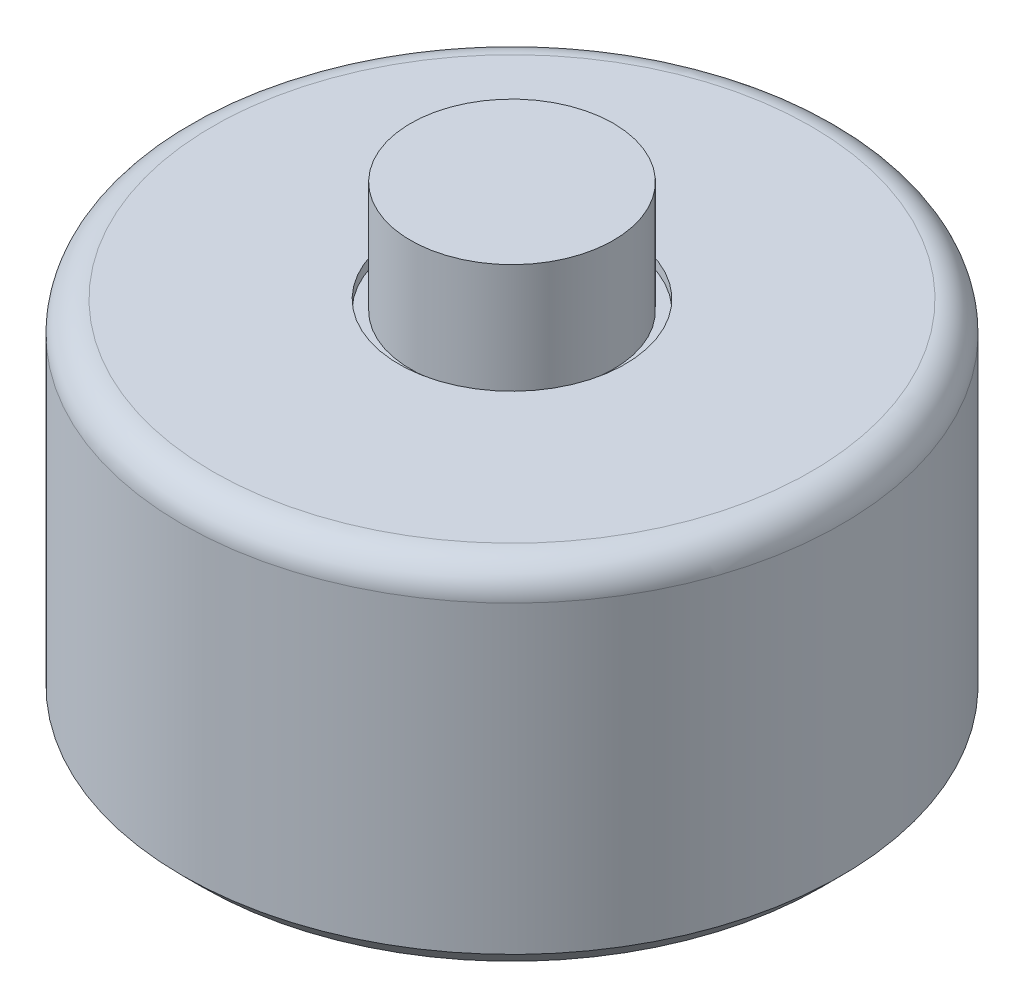
ISO-10303-21;
HEADER;
FILE_DESCRIPTION(('STEP AP214'),'2;1');
FILE_NAME('part.step','',(''),(''),'','','');
FILE_SCHEMA(('AUTOMOTIVE_DESIGN { 1 0 10303 214 1 1 1 1 }'));
ENDSEC;
DATA;
#1=APPLICATION_CONTEXT('core data for automotive mechanical design processes');
#2=APPLICATION_PROTOCOL_DEFINITION('international standard','automotive_design',2000,#1);
#3=PRODUCT_CONTEXT('',#1,'mechanical');
#4=PRODUCT('Part','Part','',(#3));
#5=PRODUCT_RELATED_PRODUCT_CATEGORY('part','',(#4));
#6=PRODUCT_DEFINITION_FORMATION('','',#4);
#7=PRODUCT_DEFINITION_CONTEXT('part definition',#1,'design');
#8=PRODUCT_DEFINITION('design','',#6,#7);
#9=PRODUCT_DEFINITION_SHAPE('','',#8);
#10=(LENGTH_UNIT() NAMED_UNIT(*) SI_UNIT(.MILLI.,.METRE.));
#11=(NAMED_UNIT(*) PLANE_ANGLE_UNIT() SI_UNIT($,.RADIAN.));
#12=(NAMED_UNIT(*) SI_UNIT($,.STERADIAN.) SOLID_ANGLE_UNIT());
#13=UNCERTAINTY_MEASURE_WITH_UNIT(LENGTH_MEASURE(1.E-05),#10,'distance_accuracy_value','');
#14=(GEOMETRIC_REPRESENTATION_CONTEXT(3) GLOBAL_UNCERTAINTY_ASSIGNED_CONTEXT((#13)) GLOBAL_UNIT_ASSIGNED_CONTEXT((#10,
#11,#12)) REPRESENTATION_CONTEXT('',''));
#15=CARTESIAN_POINT('',(0.,0.,0.));
#16=DIRECTION('',(0.,0.,1.));
#17=DIRECTION('',(1.,0.,0.));
#18=AXIS2_PLACEMENT_3D('',#15,#16,#17);
#19=CARTESIAN_POINT('',(8.255,0.,0.));
#20=DIRECTION('',(0.,-1.,0.));
#21=DIRECTION('',(0.,0.,-1.));
#22=AXIS2_PLACEMENT_3D('',#19,#20,#21);
#23=PLANE('',#22);
#24=DIRECTION('',(1.,0.,0.));
#25=VECTOR('',#24,1.);
#26=CARTESIAN_POINT('',(-0.539750000000016,0.,4.826));
#27=LINE('',#26,#25);
#28=CARTESIAN_POINT('',(-0.539750000000016,0.,4.826));
#29=VERTEX_POINT('',#28);
#30=CARTESIAN_POINT('',(0.539749999999983,0.,4.826));
#31=VERTEX_POINT('',#30);
#32=EDGE_CURVE('E64',#29,#31,#27,.T.);
#33=ORIENTED_EDGE('',*,*,#32,.F.);
#34=DIRECTION('',(0.,0.,-1.));
#35=VECTOR('',#34,1.);
#36=CARTESIAN_POINT('',(-0.539750000000016,0.,4.826));
#37=LINE('',#36,#35);
#38=CARTESIAN_POINT('',(-0.539750000000024,0.,6.731));
#39=VERTEX_POINT('',#38);
#40=EDGE_CURVE('E200',#39,#29,#37,.T.);
#41=ORIENTED_EDGE('',*,*,#40,.F.);
#42=DIRECTION('',(-1.,0.,0.));
#43=VECTOR('',#42,1.);
#44=CARTESIAN_POINT('',(-0.539750000000024,0.,6.731));
#45=LINE('',#44,#43);
#46=CARTESIAN_POINT('',(0.539749999999976,0.,6.731));
#47=VERTEX_POINT('',#46);
#48=EDGE_CURVE('E188',#47,#39,#45,.T.);
#49=ORIENTED_EDGE('',*,*,#48,.F.);
#50=DIRECTION('',(0.,0.,1.));
#51=VECTOR('',#50,1.);
#52=CARTESIAN_POINT('',(0.539749999999983,0.,4.826));
#53=LINE('',#52,#51);
#54=EDGE_CURVE('E174',#31,#47,#53,.T.);
#55=ORIENTED_EDGE('',*,*,#54,.F.);
#56=EDGE_LOOP('',(#33,#41,#49,#55));
#57=FACE_BOUND('',#56,.T.);
#58=DIRECTION('',(0.,0.,1.));
#59=VECTOR('',#58,1.);
#60=CARTESIAN_POINT('',(-4.826,0.,-0.53975));
#61=LINE('',#60,#59);
#62=CARTESIAN_POINT('',(-4.826,0.,-0.53975));
#63=VERTEX_POINT('',#62);
#64=CARTESIAN_POINT('',(-4.826,0.,0.53975));
#65=VERTEX_POINT('',#64);
#66=EDGE_CURVE('E72',#63,#65,#61,.T.);
#67=ORIENTED_EDGE('',*,*,#66,.F.);
#68=DIRECTION('',(1.,0.,0.));
#69=VECTOR('',#68,1.);
#70=CARTESIAN_POINT('',(-4.826,0.,-0.53975));
#71=LINE('',#70,#69);
#72=CARTESIAN_POINT('',(-6.731,0.,-0.53975));
#73=VERTEX_POINT('',#72);
#74=EDGE_CURVE('E240',#73,#63,#71,.T.);
#75=ORIENTED_EDGE('',*,*,#74,.F.);
#76=DIRECTION('',(0.,0.,-1.));
#77=VECTOR('',#76,1.);
#78=CARTESIAN_POINT('',(-6.731,0.,-0.53975));
#79=LINE('',#78,#77);
#80=CARTESIAN_POINT('',(-6.731,0.,0.53975));
#81=VERTEX_POINT('',#80);
#82=EDGE_CURVE('E233',#81,#73,#79,.T.);
#83=ORIENTED_EDGE('',*,*,#82,.F.);
#84=DIRECTION('',(-1.,0.,0.));
#85=VECTOR('',#84,1.);
#86=CARTESIAN_POINT('',(-4.826,0.,0.53975));
#87=LINE('',#86,#85);
#88=EDGE_CURVE('E209',#65,#81,#87,.T.);
#89=ORIENTED_EDGE('',*,*,#88,.F.);
#90=EDGE_LOOP('',(#67,#75,#83,#89));
#91=FACE_BOUND('',#90,.T.);
#92=DIRECTION('',(-1.,0.,0.));
#93=VECTOR('',#92,1.);
#94=CARTESIAN_POINT('',(0.53975000000005,0.,-4.82599999999999));
#95=LINE('',#94,#93);
#96=CARTESIAN_POINT('',(0.53975000000005,0.,-4.82599999999999));
#97=VERTEX_POINT('',#96);
#98=CARTESIAN_POINT('',(-0.539749999999948,0.,-4.82600000000001));
#99=VERTEX_POINT('',#98);
#100=EDGE_CURVE('E213',#97,#99,#95,.T.);
#101=ORIENTED_EDGE('',*,*,#100,.F.);
#102=DIRECTION('',(0.,0.,1.));
#103=VECTOR('',#102,1.);
#104=CARTESIAN_POINT('',(0.53975000000005,0.,-4.82599999999999));
#105=LINE('',#104,#103);
#106=CARTESIAN_POINT('',(0.539750000000071,0.,-6.73099999999999));
#107=VERTEX_POINT('',#106);
#108=EDGE_CURVE('E279',#107,#97,#105,.T.);
#109=ORIENTED_EDGE('',*,*,#108,.F.);
#110=DIRECTION('',(1.,0.,0.));
#111=VECTOR('',#110,1.);
#112=CARTESIAN_POINT('',(0.539750000000071,0.,-6.73099999999999));
#113=LINE('',#112,#111);
#114=CARTESIAN_POINT('',(-0.539749999999929,0.,-6.73100000000001));
#115=VERTEX_POINT('',#114);
#116=EDGE_CURVE('E272',#115,#107,#113,.T.);
#117=ORIENTED_EDGE('',*,*,#116,.F.);
#118=DIRECTION('',(0.,0.,-1.));
#119=VECTOR('',#118,1.);
#120=CARTESIAN_POINT('',(-0.539749999999949,0.,-4.82600000000001));
#121=LINE('',#120,#119);
#122=EDGE_CURVE('E248',#99,#115,#121,.T.);
#123=ORIENTED_EDGE('',*,*,#122,.F.);
#124=EDGE_LOOP('',(#101,#109,#117,#123));
#125=FACE_BOUND('',#124,.T.);
#126=DIRECTION('',(0.,0.,-1.));
#127=VECTOR('',#126,1.);
#128=CARTESIAN_POINT('',(4.826,0.,0.53975));
#129=LINE('',#128,#127);
#130=CARTESIAN_POINT('',(4.826,0.,0.53975));
#131=VERTEX_POINT('',#130);
#132=CARTESIAN_POINT('',(4.826,0.,-0.53975));
#133=VERTEX_POINT('',#132);
#134=EDGE_CURVE('E208',#131,#133,#129,.T.);
#135=ORIENTED_EDGE('',*,*,#134,.F.);
#136=DIRECTION('',(-1.,0.,0.));
#137=VECTOR('',#136,1.);
#138=CARTESIAN_POINT('',(4.826,0.,0.53975));
#139=LINE('',#138,#137);
#140=CARTESIAN_POINT('',(6.731,0.,0.53975));
#141=VERTEX_POINT('',#140);
#142=EDGE_CURVE('E293',#141,#131,#139,.T.);
#143=ORIENTED_EDGE('',*,*,#142,.F.);
#144=DIRECTION('',(0.,0.,1.));
#145=VECTOR('',#144,1.);
#146=CARTESIAN_POINT('',(6.731,0.,0.53975));
#147=LINE('',#146,#145);
#148=CARTESIAN_POINT('',(6.731,0.,-0.53975));
#149=VERTEX_POINT('',#148);
#150=EDGE_CURVE('E312',#149,#141,#147,.T.);
#151=ORIENTED_EDGE('',*,*,#150,.F.);
#152=DIRECTION('',(1.,0.,0.));
#153=VECTOR('',#152,1.);
#154=CARTESIAN_POINT('',(4.826,0.,-0.53975));
#155=LINE('',#154,#153);
#156=EDGE_CURVE('E308',#133,#149,#155,.T.);
#157=ORIENTED_EDGE('',*,*,#156,.F.);
#158=EDGE_LOOP('',(#135,#143,#151,#157));
#159=FACE_BOUND('',#158,.T.);
#160=CARTESIAN_POINT('',(0.,0.,0.));
#161=DIRECTION('',(0.,-1.,0.));
#162=DIRECTION('',(0.,0.,-1.));
#163=AXIS2_PLACEMENT_3D('',#160,#161,#162);
#164=CIRCLE('',#163,7.747);
#165=CARTESIAN_POINT('',(0.,0.,-7.747));
#166=VERTEX_POINT('',#165);
#167=EDGE_CURVE('E57',#166,#166,#164,.T.);
#168=ORIENTED_EDGE('',*,*,#167,.T.);
#169=EDGE_LOOP('',(#168));
#170=FACE_BOUND('',#169,.T.);
#171=ADVANCED_FACE('F47',(#57,#91,#125,#159,#170),#23,.T.);
#172=CARTESIAN_POINT('',(0.,11.43,0.));
#173=DIRECTION('',(0.,1.,0.));
#174=DIRECTION('',(0.,0.,1.));
#175=AXIS2_PLACEMENT_3D('',#172,#173,#174);
#176=PLANE('',#175);
#177=CARTESIAN_POINT('',(0.,11.43,0.));
#178=DIRECTION('',(0.,-1.,0.));
#179=DIRECTION('',(0.,0.,-1.));
#180=AXIS2_PLACEMENT_3D('',#177,#178,#179);
#181=CIRCLE('',#180,2.54);
#182=CARTESIAN_POINT('',(0.,11.43,-2.54));
#183=VERTEX_POINT('',#182);
#184=EDGE_CURVE('E343',#183,#183,#181,.T.);
#185=ORIENTED_EDGE('',*,*,#184,.F.);
#186=EDGE_LOOP('',(#185));
#187=FACE_BOUND('',#186,.T.);
#188=ADVANCED_FACE('F374',(#187),#176,.T.);
#189=CARTESIAN_POINT('',(0.,0.,0.));
#190=DIRECTION('',(0.,-1.,0.));
#191=DIRECTION('',(0.,0.,-1.));
#192=AXIS2_PLACEMENT_3D('',#189,#190,#191);
#193=CYLINDRICAL_SURFACE('',#192,2.54);
#194=ORIENTED_EDGE('',*,*,#184,.T.);
#195=EDGE_LOOP('',(#194));
#196=FACE_BOUND('',#195,.T.);
#197=CARTESIAN_POINT('',(0.,8.636,0.));
#198=DIRECTION('',(0.,-1.,0.));
#199=DIRECTION('',(0.,0.,-1.));
#200=AXIS2_PLACEMENT_3D('',#197,#198,#199);
#201=CIRCLE('',#200,2.54);
#202=CARTESIAN_POINT('',(0.,8.636,-2.54));
#203=VERTEX_POINT('',#202);
#204=EDGE_CURVE('E339',#203,#203,#201,.T.);
#205=ORIENTED_EDGE('',*,*,#204,.F.);
#206=EDGE_LOOP('',(#205));
#207=FACE_BOUND('',#206,.T.);
#208=ADVANCED_FACE('F380',(#196,#207),#193,.T.);
#209=CARTESIAN_POINT('',(2.54,8.636,0.));
#210=DIRECTION('',(0.,1.,0.));
#211=DIRECTION('',(0.,0.,1.));
#212=AXIS2_PLACEMENT_3D('',#209,#210,#211);
#213=PLANE('',#212);
#214=ORIENTED_EDGE('',*,*,#204,.T.);
#215=EDGE_LOOP('',(#214));
#216=FACE_BOUND('',#215,.T.);
#217=CARTESIAN_POINT('',(0.,8.636,0.));
#218=DIRECTION('',(0.,-1.,0.));
#219=DIRECTION('',(0.,0.,-1.));
#220=AXIS2_PLACEMENT_3D('',#217,#218,#219);
#221=CIRCLE('',#220,2.8321);
#222=CARTESIAN_POINT('',(0.,8.636,-2.8321));
#223=VERTEX_POINT('',#222);
#224=EDGE_CURVE('E335',#223,#223,#221,.T.);
#225=ORIENTED_EDGE('',*,*,#224,.F.);
#226=EDGE_LOOP('',(#225));
#227=FACE_BOUND('',#226,.T.);
#228=ADVANCED_FACE('F387',(#216,#227),#213,.T.);
#229=CARTESIAN_POINT('',(0.,0.,0.));
#230=DIRECTION('',(0.,-1.,0.));
#231=DIRECTION('',(0.,0.,-1.));
#232=AXIS2_PLACEMENT_3D('',#229,#230,#231);
#233=CYLINDRICAL_SURFACE('',#232,2.8321);
#234=ORIENTED_EDGE('',*,*,#224,.T.);
#235=EDGE_LOOP('',(#234));
#236=FACE_BOUND('',#235,.T.);
#237=CARTESIAN_POINT('',(0.,8.89,0.));
#238=DIRECTION('',(0.,-1.,0.));
#239=DIRECTION('',(0.,0.,-1.));
#240=AXIS2_PLACEMENT_3D('',#237,#238,#239);
#241=CIRCLE('',#240,2.8321);
#242=CARTESIAN_POINT('',(0.,8.89,-2.8321));
#243=VERTEX_POINT('',#242);
#244=EDGE_CURVE('E322',#243,#243,#241,.T.);
#245=ORIENTED_EDGE('',*,*,#244,.F.);
#246=EDGE_LOOP('',(#245));
#247=FACE_BOUND('',#246,.T.);
#248=ADVANCED_FACE('F391',(#236,#247),#233,.F.);
#249=CARTESIAN_POINT('',(2.8321,8.89,0.));
#250=DIRECTION('',(0.,1.,0.));
#251=DIRECTION('',(0.,0.,1.));
#252=AXIS2_PLACEMENT_3D('',#249,#250,#251);
#253=PLANE('',#252);
#254=CARTESIAN_POINT('',(0.,8.89,0.));
#255=DIRECTION('',(0.,1.,0.));
#256=DIRECTION('',(0.,0.,1.));
#257=AXIS2_PLACEMENT_3D('',#254,#255,#256);
#258=CIRCLE('',#257,7.493);
#259=CARTESIAN_POINT('',(0.,8.89,7.493));
#260=VERTEX_POINT('',#259);
#261=EDGE_CURVE('E351',#260,#260,#258,.T.);
#262=ORIENTED_EDGE('',*,*,#261,.T.);
#263=EDGE_LOOP('',(#262));
#264=FACE_BOUND('',#263,.T.);
#265=ORIENTED_EDGE('',*,*,#244,.T.);
#266=EDGE_LOOP('',(#265));
#267=FACE_BOUND('',#266,.T.);
#268=ADVANCED_FACE('F395',(#264,#267),#253,.T.);
#269=CARTESIAN_POINT('',(0.,0.,0.));
#270=DIRECTION('',(0.,-1.,0.));
#271=DIRECTION('',(0.,0.,-1.));
#272=AXIS2_PLACEMENT_3D('',#269,#270,#271);
#273=CYLINDRICAL_SURFACE('',#272,8.255);
#274=CARTESIAN_POINT('',(0.,0.508000000000002,0.));
#275=DIRECTION('',(0.,-1.,0.));
#276=DIRECTION('',(0.,0.,-1.));
#277=AXIS2_PLACEMENT_3D('',#274,#275,#276);
#278=CIRCLE('',#277,8.255);
#279=CARTESIAN_POINT('',(0.,0.508000000000002,-8.255));
#280=VERTEX_POINT('',#279);
#281=EDGE_CURVE('E11',#280,#280,#278,.F.);
#282=ORIENTED_EDGE('',*,*,#281,.T.);
#283=EDGE_LOOP('',(#282));
#284=FACE_BOUND('',#283,.T.);
#285=CARTESIAN_POINT('',(0.,8.128,0.));
#286=DIRECTION('',(0.,1.,0.));
#287=DIRECTION('',(0.,0.,1.));
#288=AXIS2_PLACEMENT_3D('',#285,#286,#287);
#289=CIRCLE('',#288,8.255);
#290=CARTESIAN_POINT('',(0.,8.128,8.255));
#291=VERTEX_POINT('',#290);
#292=EDGE_CURVE('E347',#291,#291,#289,.F.);
#293=ORIENTED_EDGE('',*,*,#292,.T.);
#294=EDGE_LOOP('',(#293));
#295=FACE_BOUND('',#294,.T.);
#296=ADVANCED_FACE('F370',(#284,#295),#273,.T.);
#297=CARTESIAN_POINT('',(0.,8.128,0.));
#298=DIRECTION('',(0.,1.,0.));
#299=DIRECTION('',(0.,0.,1.));
#300=AXIS2_PLACEMENT_3D('',#297,#298,#299);
#301=TOROIDAL_SURFACE('',#300,7.493,0.762);
#302=ORIENTED_EDGE('',*,*,#261,.F.);
#303=EDGE_LOOP('',(#302));
#304=FACE_BOUND('',#303,.T.);
#305=ORIENTED_EDGE('',*,*,#292,.F.);
#306=EDGE_LOOP('',(#305));
#307=FACE_BOUND('',#306,.T.);
#308=ADVANCED_FACE('F361',(#304,#307),#301,.T.);
#309=CARTESIAN_POINT('',(0.,0.,0.));
#310=DIRECTION('',(0.,1.,0.));
#311=DIRECTION('',(0.,0.,1.));
#312=AXIS2_PLACEMENT_3D('',#309,#310,#311);
#313=CONICAL_SURFACE('',#312,7.747,0.785398163397445);
#314=ORIENTED_EDGE('',*,*,#281,.F.);
#315=EDGE_LOOP('',(#314));
#316=FACE_BOUND('',#315,.T.);
#317=ORIENTED_EDGE('',*,*,#167,.F.);
#318=EDGE_LOOP('',(#317));
#319=FACE_BOUND('',#318,.T.);
#320=ADVANCED_FACE('F50',(#316,#319),#313,.T.);
#321=CARTESIAN_POINT('',(4.826,0.5715,0.53975));
#322=DIRECTION('',(-1.,0.,0.));
#323=DIRECTION('',(0.,0.,1.));
#324=AXIS2_PLACEMENT_3D('',#321,#322,#323);
#325=PLANE('',#324);
#326=ORIENTED_EDGE('',*,*,#134,.T.);
#327=DIRECTION('',(0.,-1.,0.));
#328=VECTOR('',#327,1.);
#329=CARTESIAN_POINT('',(4.826,0.5715,-0.53975));
#330=LINE('',#329,#328);
#331=CARTESIAN_POINT('',(4.826,0.5715,-0.53975));
#332=VERTEX_POINT('',#331);
#333=EDGE_CURVE('E305',#332,#133,#330,.T.);
#334=ORIENTED_EDGE('',*,*,#333,.F.);
#335=DIRECTION('',(0.,0.,-1.));
#336=VECTOR('',#335,1.);
#337=CARTESIAN_POINT('',(4.826,0.5715,0.53975));
#338=LINE('',#337,#336);
#339=CARTESIAN_POINT('',(4.826,0.5715,0.53975));
#340=VERTEX_POINT('',#339);
#341=EDGE_CURVE('E288',#340,#332,#338,.T.);
#342=ORIENTED_EDGE('',*,*,#341,.F.);
#343=DIRECTION('',(0.,-1.,0.));
#344=VECTOR('',#343,1.);
#345=CARTESIAN_POINT('',(4.826,0.5715,0.53975));
#346=LINE('',#345,#344);
#347=EDGE_CURVE('E319',#340,#131,#346,.T.);
#348=ORIENTED_EDGE('',*,*,#347,.T.);
#349=EDGE_LOOP('',(#326,#334,#342,#348));
#350=FACE_BOUND('',#349,.T.);
#351=ADVANCED_FACE('F360',(#350),#325,.F.);
#352=CARTESIAN_POINT('',(4.826,0.5715,0.53975));
#353=DIRECTION('',(0.,0.,1.));
#354=DIRECTION('',(1.,0.,0.));
#355=AXIS2_PLACEMENT_3D('',#352,#353,#354);
#356=PLANE('',#355);
#357=ORIENTED_EDGE('',*,*,#142,.T.);
#358=ORIENTED_EDGE('',*,*,#347,.F.);
#359=DIRECTION('',(-1.,0.,0.));
#360=VECTOR('',#359,1.);
#361=CARTESIAN_POINT('',(4.826,0.5715,0.53975));
#362=LINE('',#361,#360);
#363=CARTESIAN_POINT('',(6.731,0.5715,0.53975));
#364=VERTEX_POINT('',#363);
#365=EDGE_CURVE('E301',#364,#340,#362,.T.);
#366=ORIENTED_EDGE('',*,*,#365,.F.);
#367=DIRECTION('',(0.,-1.,0.));
#368=VECTOR('',#367,1.);
#369=CARTESIAN_POINT('',(6.731,0.5715,0.53975));
#370=LINE('',#369,#368);
#371=EDGE_CURVE('E323',#364,#141,#370,.T.);
#372=ORIENTED_EDGE('',*,*,#371,.T.);
#373=EDGE_LOOP('',(#357,#358,#366,#372));
#374=FACE_BOUND('',#373,.T.);
#375=ADVANCED_FACE('F367',(#374),#356,.F.);
#376=CARTESIAN_POINT('',(6.731,0.5715,0.53975));
#377=DIRECTION('',(1.,0.,0.));
#378=DIRECTION('',(0.,0.,-1.));
#379=AXIS2_PLACEMENT_3D('',#376,#377,#378);
#380=PLANE('',#379);
#381=ORIENTED_EDGE('',*,*,#150,.T.);
#382=ORIENTED_EDGE('',*,*,#371,.F.);
#383=DIRECTION('',(0.,0.,1.));
#384=VECTOR('',#383,1.);
#385=CARTESIAN_POINT('',(6.731,0.5715,0.53975));
#386=LINE('',#385,#384);
#387=CARTESIAN_POINT('',(6.731,0.5715,-0.53975));
#388=VERTEX_POINT('',#387);
#389=EDGE_CURVE('E297',#388,#364,#386,.T.);
#390=ORIENTED_EDGE('',*,*,#389,.F.);
#391=DIRECTION('',(0.,-1.,0.));
#392=VECTOR('',#391,1.);
#393=CARTESIAN_POINT('',(6.731,0.5715,-0.53975));
#394=LINE('',#393,#392);
#395=EDGE_CURVE('E326',#388,#149,#394,.T.);
#396=ORIENTED_EDGE('',*,*,#395,.T.);
#397=EDGE_LOOP('',(#381,#382,#390,#396));
#398=FACE_BOUND('',#397,.T.);
#399=ADVANCED_FACE('F407',(#398),#380,.F.);
#400=CARTESIAN_POINT('',(4.826,0.5715,-0.53975));
#401=DIRECTION('',(0.,0.,-1.));
#402=DIRECTION('',(-1.,0.,0.));
#403=AXIS2_PLACEMENT_3D('',#400,#401,#402);
#404=PLANE('',#403);
#405=ORIENTED_EDGE('',*,*,#156,.T.);
#406=ORIENTED_EDGE('',*,*,#395,.F.);
#407=DIRECTION('',(1.,0.,0.));
#408=VECTOR('',#407,1.);
#409=CARTESIAN_POINT('',(4.826,0.5715,-0.53975));
#410=LINE('',#409,#408);
#411=EDGE_CURVE('E292',#332,#388,#410,.T.);
#412=ORIENTED_EDGE('',*,*,#411,.F.);
#413=ORIENTED_EDGE('',*,*,#333,.T.);
#414=EDGE_LOOP('',(#405,#406,#412,#413));
#415=FACE_BOUND('',#414,.T.);
#416=ADVANCED_FACE('F403',(#415),#404,.F.);
#417=CARTESIAN_POINT('',(0.,0.5715,0.));
#418=DIRECTION('',(0.,-1.,0.));
#419=DIRECTION('',(0.,0.,-1.));
#420=AXIS2_PLACEMENT_3D('',#417,#418,#419);
#421=PLANE('',#420);
#422=ORIENTED_EDGE('',*,*,#341,.T.);
#423=ORIENTED_EDGE('',*,*,#411,.T.);
#424=ORIENTED_EDGE('',*,*,#389,.T.);
#425=ORIENTED_EDGE('',*,*,#365,.T.);
#426=EDGE_LOOP('',(#422,#423,#424,#425));
#427=FACE_BOUND('',#426,.T.);
#428=ADVANCED_FACE('F406',(#427),#421,.T.);
#429=CARTESIAN_POINT('',(0.53975000000005,0.5715,-4.82599999999999));
#430=DIRECTION('',(0.,0.,1.));
#431=DIRECTION('',(1.,0.,0.));
#432=AXIS2_PLACEMENT_3D('',#429,#430,#431);
#433=PLANE('',#432);
#434=ORIENTED_EDGE('',*,*,#100,.T.);
#435=DIRECTION('',(0.,-1.,0.));
#436=VECTOR('',#435,1.);
#437=CARTESIAN_POINT('',(-0.539749999999949,0.5715,-4.82600000000001));
#438=LINE('',#437,#436);
#439=CARTESIAN_POINT('',(-0.539749999999949,0.5715,-4.82600000000001));
#440=VERTEX_POINT('',#439);
#441=EDGE_CURVE('E268',#440,#99,#438,.T.);
#442=ORIENTED_EDGE('',*,*,#441,.F.);
#443=DIRECTION('',(-1.,0.,0.));
#444=VECTOR('',#443,1.);
#445=CARTESIAN_POINT('',(0.53975000000005,0.5715,-4.82599999999999));
#446=LINE('',#445,#444);
#447=CARTESIAN_POINT('',(0.53975000000005,0.5715,-4.82599999999999));
#448=VERTEX_POINT('',#447);
#449=EDGE_CURVE('E251',#448,#440,#446,.T.);
#450=ORIENTED_EDGE('',*,*,#449,.F.);
#451=DIRECTION('',(0.,-1.,0.));
#452=VECTOR('',#451,1.);
#453=CARTESIAN_POINT('',(0.53975000000005,0.5715,-4.82599999999999));
#454=LINE('',#453,#452);
#455=EDGE_CURVE('E282',#448,#97,#454,.T.);
#456=ORIENTED_EDGE('',*,*,#455,.T.);
#457=EDGE_LOOP('',(#434,#442,#450,#456));
#458=FACE_BOUND('',#457,.T.);
#459=ADVANCED_FACE('F417',(#458),#433,.F.);
#460=CARTESIAN_POINT('',(0.53975000000005,0.5715,-4.82599999999999));
#461=DIRECTION('',(1.,0.,0.));
#462=DIRECTION('',(0.,0.,-1.));
#463=AXIS2_PLACEMENT_3D('',#460,#461,#462);
#464=PLANE('',#463);
#465=ORIENTED_EDGE('',*,*,#108,.T.);
#466=ORIENTED_EDGE('',*,*,#455,.F.);
#467=DIRECTION('',(0.,0.,1.));
#468=VECTOR('',#467,1.);
#469=CARTESIAN_POINT('',(0.53975000000005,0.5715,-4.82599999999999));
#470=LINE('',#469,#468);
#471=CARTESIAN_POINT('',(0.539750000000071,0.5715,-6.73099999999999));
#472=VERTEX_POINT('',#471);
#473=EDGE_CURVE('E260',#472,#448,#470,.T.);
#474=ORIENTED_EDGE('',*,*,#473,.F.);
#475=DIRECTION('',(0.,-1.,0.));
#476=VECTOR('',#475,1.);
#477=CARTESIAN_POINT('',(0.539750000000071,0.5715,-6.73099999999999));
#478=LINE('',#477,#476);
#479=EDGE_CURVE('E275',#472,#107,#478,.T.);
#480=ORIENTED_EDGE('',*,*,#479,.T.);
#481=EDGE_LOOP('',(#465,#466,#474,#480));
#482=FACE_BOUND('',#481,.T.);
#483=ADVANCED_FACE('F421',(#482),#464,.F.);
#484=CARTESIAN_POINT('',(0.539750000000071,0.5715,-6.73099999999999));
#485=DIRECTION('',(0.,0.,-1.));
#486=DIRECTION('',(-1.,0.,0.));
#487=AXIS2_PLACEMENT_3D('',#484,#485,#486);
#488=PLANE('',#487);
#489=ORIENTED_EDGE('',*,*,#116,.T.);
#490=ORIENTED_EDGE('',*,*,#479,.F.);
#491=DIRECTION('',(1.,0.,0.));
#492=VECTOR('',#491,1.);
#493=CARTESIAN_POINT('',(0.539750000000071,0.5715,-6.73099999999999));
#494=LINE('',#493,#492);
#495=CARTESIAN_POINT('',(-0.539749999999929,0.5715,-6.73100000000001));
#496=VERTEX_POINT('',#495);
#497=EDGE_CURVE('E257',#496,#472,#494,.T.);
#498=ORIENTED_EDGE('',*,*,#497,.F.);
#499=DIRECTION('',(0.,-1.,0.));
#500=VECTOR('',#499,1.);
#501=CARTESIAN_POINT('',(-0.539749999999929,0.5715,-6.73100000000001));
#502=LINE('',#501,#500);
#503=EDGE_CURVE('E264',#496,#115,#502,.T.);
#504=ORIENTED_EDGE('',*,*,#503,.T.);
#505=EDGE_LOOP('',(#489,#490,#498,#504));
#506=FACE_BOUND('',#505,.T.);
#507=ADVANCED_FACE('F425',(#506),#488,.F.);
#508=CARTESIAN_POINT('',(-0.539749999999949,0.5715,-4.82600000000001));
#509=DIRECTION('',(-1.,0.,0.));
#510=DIRECTION('',(0.,0.,1.));
#511=AXIS2_PLACEMENT_3D('',#508,#509,#510);
#512=PLANE('',#511);
#513=ORIENTED_EDGE('',*,*,#122,.T.);
#514=ORIENTED_EDGE('',*,*,#503,.F.);
#515=DIRECTION('',(0.,0.,-1.));
#516=VECTOR('',#515,1.);
#517=CARTESIAN_POINT('',(-0.539749999999949,0.5715,-4.82600000000001));
#518=LINE('',#517,#516);
#519=EDGE_CURVE('E254',#440,#496,#518,.T.);
#520=ORIENTED_EDGE('',*,*,#519,.F.);
#521=ORIENTED_EDGE('',*,*,#441,.T.);
#522=EDGE_LOOP('',(#513,#514,#520,#521));
#523=FACE_BOUND('',#522,.T.);
#524=ADVANCED_FACE('F429',(#523),#512,.F.);
#525=CARTESIAN_POINT('',(0.,0.5715,0.));
#526=DIRECTION('',(0.,-1.,0.));
#527=DIRECTION('',(-1.,0.,0.));
#528=AXIS2_PLACEMENT_3D('',#525,#526,#527);
#529=PLANE('',#528);
#530=ORIENTED_EDGE('',*,*,#449,.T.);
#531=ORIENTED_EDGE('',*,*,#519,.T.);
#532=ORIENTED_EDGE('',*,*,#497,.T.);
#533=ORIENTED_EDGE('',*,*,#473,.T.);
#534=EDGE_LOOP('',(#530,#531,#532,#533));
#535=FACE_BOUND('',#534,.T.);
#536=ADVANCED_FACE('F433',(#535),#529,.T.);
#537=CARTESIAN_POINT('',(-4.826,0.5715,-0.53975));
#538=DIRECTION('',(1.,0.,0.));
#539=DIRECTION('',(0.,0.,-1.));
#540=AXIS2_PLACEMENT_3D('',#537,#538,#539);
#541=PLANE('',#540);
#542=ORIENTED_EDGE('',*,*,#66,.T.);
#543=DIRECTION('',(0.,-1.,0.));
#544=VECTOR('',#543,1.);
#545=CARTESIAN_POINT('',(-4.826,0.5715,0.53975));
#546=LINE('',#545,#544);
#547=CARTESIAN_POINT('',(-4.826,0.5715,0.53975));
#548=VERTEX_POINT('',#547);
#549=EDGE_CURVE('E230',#548,#65,#546,.T.);
#550=ORIENTED_EDGE('',*,*,#549,.F.);
#551=DIRECTION('',(0.,0.,1.));
#552=VECTOR('',#551,1.);
#553=CARTESIAN_POINT('',(-4.826,0.5715,-0.53975));
#554=LINE('',#553,#552);
#555=CARTESIAN_POINT('',(-4.826,0.5715,-0.53975));
#556=VERTEX_POINT('',#555);
#557=EDGE_CURVE('E212',#556,#548,#554,.T.);
#558=ORIENTED_EDGE('',*,*,#557,.F.);
#559=DIRECTION('',(0.,-1.,0.));
#560=VECTOR('',#559,1.);
#561=CARTESIAN_POINT('',(-4.826,0.5715,-0.53975));
#562=LINE('',#561,#560);
#563=EDGE_CURVE('E243',#556,#63,#562,.T.);
#564=ORIENTED_EDGE('',*,*,#563,.T.);
#565=EDGE_LOOP('',(#542,#550,#558,#564));
#566=FACE_BOUND('',#565,.T.);
#567=ADVANCED_FACE('F437',(#566),#541,.F.);
#568=CARTESIAN_POINT('',(-4.826,0.5715,-0.53975));
#569=DIRECTION('',(0.,0.,-1.));
#570=DIRECTION('',(-1.,0.,0.));
#571=AXIS2_PLACEMENT_3D('',#568,#569,#570);
#572=PLANE('',#571);
#573=ORIENTED_EDGE('',*,*,#74,.T.);
#574=ORIENTED_EDGE('',*,*,#563,.F.);
#575=DIRECTION('',(1.,0.,0.));
#576=VECTOR('',#575,1.);
#577=CARTESIAN_POINT('',(-4.826,0.5715,-0.53975));
#578=LINE('',#577,#576);
#579=CARTESIAN_POINT('',(-6.731,0.5715,-0.53975));
#580=VERTEX_POINT('',#579);
#581=EDGE_CURVE('E222',#580,#556,#578,.T.);
#582=ORIENTED_EDGE('',*,*,#581,.F.);
#583=DIRECTION('',(0.,-1.,0.));
#584=VECTOR('',#583,1.);
#585=CARTESIAN_POINT('',(-6.731,0.5715,-0.53975));
#586=LINE('',#585,#584);
#587=EDGE_CURVE('E236',#580,#73,#586,.T.);
#588=ORIENTED_EDGE('',*,*,#587,.T.);
#589=EDGE_LOOP('',(#573,#574,#582,#588));
#590=FACE_BOUND('',#589,.T.);
#591=ADVANCED_FACE('F441',(#590),#572,.F.);
#592=CARTESIAN_POINT('',(-6.731,0.5715,-0.53975));
#593=DIRECTION('',(-1.,0.,0.));
#594=DIRECTION('',(0.,0.,1.));
#595=AXIS2_PLACEMENT_3D('',#592,#593,#594);
#596=PLANE('',#595);
#597=ORIENTED_EDGE('',*,*,#82,.T.);
#598=ORIENTED_EDGE('',*,*,#587,.F.);
#599=DIRECTION('',(0.,0.,-1.));
#600=VECTOR('',#599,1.);
#601=CARTESIAN_POINT('',(-6.731,0.5715,-0.53975));
#602=LINE('',#601,#600);
#603=CARTESIAN_POINT('',(-6.731,0.5715,0.53975));
#604=VERTEX_POINT('',#603);
#605=EDGE_CURVE('E219',#604,#580,#602,.T.);
#606=ORIENTED_EDGE('',*,*,#605,.F.);
#607=DIRECTION('',(0.,-1.,0.));
#608=VECTOR('',#607,1.);
#609=CARTESIAN_POINT('',(-6.731,0.5715,0.53975));
#610=LINE('',#609,#608);
#611=EDGE_CURVE('E226',#604,#81,#610,.T.);
#612=ORIENTED_EDGE('',*,*,#611,.T.);
#613=EDGE_LOOP('',(#597,#598,#606,#612));
#614=FACE_BOUND('',#613,.T.);
#615=ADVANCED_FACE('F444',(#614),#596,.F.);
#616=CARTESIAN_POINT('',(-4.826,0.5715,0.53975));
#617=DIRECTION('',(0.,0.,1.));
#618=DIRECTION('',(1.,0.,0.));
#619=AXIS2_PLACEMENT_3D('',#616,#617,#618);
#620=PLANE('',#619);
#621=ORIENTED_EDGE('',*,*,#88,.T.);
#622=ORIENTED_EDGE('',*,*,#611,.F.);
#623=DIRECTION('',(-1.,0.,0.));
#624=VECTOR('',#623,1.);
#625=CARTESIAN_POINT('',(-4.826,0.5715,0.53975));
#626=LINE('',#625,#624);
#627=EDGE_CURVE('E216',#548,#604,#626,.T.);
#628=ORIENTED_EDGE('',*,*,#627,.F.);
#629=ORIENTED_EDGE('',*,*,#549,.T.);
#630=EDGE_LOOP('',(#621,#622,#628,#629));
#631=FACE_BOUND('',#630,.T.);
#632=ADVANCED_FACE('F448',(#631),#620,.F.);
#633=CARTESIAN_POINT('',(0.,0.5715,0.));
#634=DIRECTION('',(0.,-1.,0.));
#635=DIRECTION('',(0.,0.,1.));
#636=AXIS2_PLACEMENT_3D('',#633,#634,#635);
#637=PLANE('',#636);
#638=ORIENTED_EDGE('',*,*,#557,.T.);
#639=ORIENTED_EDGE('',*,*,#627,.T.);
#640=ORIENTED_EDGE('',*,*,#605,.T.);
#641=ORIENTED_EDGE('',*,*,#581,.T.);
#642=EDGE_LOOP('',(#638,#639,#640,#641));
#643=FACE_BOUND('',#642,.T.);
#644=ADVANCED_FACE('F452',(#643),#637,.T.);
#645=CARTESIAN_POINT('',(-0.539750000000016,0.5715,4.826));
#646=DIRECTION('',(0.,0.,-1.));
#647=DIRECTION('',(-1.,0.,0.));
#648=AXIS2_PLACEMENT_3D('',#645,#646,#647);
#649=PLANE('',#648);
#650=ORIENTED_EDGE('',*,*,#32,.T.);
#651=DIRECTION('',(0.,-1.,0.));
#652=VECTOR('',#651,1.);
#653=CARTESIAN_POINT('',(0.539749999999983,0.5715,4.826));
#654=LINE('',#653,#652);
#655=CARTESIAN_POINT('',(0.539749999999983,0.5715,4.826));
#656=VERTEX_POINT('',#655);
#657=EDGE_CURVE('E179',#656,#31,#654,.T.);
#658=ORIENTED_EDGE('',*,*,#657,.F.);
#659=DIRECTION('',(1.,0.,0.));
#660=VECTOR('',#659,1.);
#661=CARTESIAN_POINT('',(-0.539750000000016,0.5715,4.826));
#662=LINE('',#661,#660);
#663=CARTESIAN_POINT('',(-0.539750000000016,0.5715,4.826));
#664=VERTEX_POINT('',#663);
#665=EDGE_CURVE('E165',#664,#656,#662,.T.);
#666=ORIENTED_EDGE('',*,*,#665,.F.);
#667=DIRECTION('',(0.,-1.,0.));
#668=VECTOR('',#667,1.);
#669=CARTESIAN_POINT('',(-0.539750000000016,0.5715,4.826));
#670=LINE('',#669,#668);
#671=EDGE_CURVE('E203',#664,#29,#670,.T.);
#672=ORIENTED_EDGE('',*,*,#671,.T.);
#673=EDGE_LOOP('',(#650,#658,#666,#672));
#674=FACE_BOUND('',#673,.T.);
#675=ADVANCED_FACE('F186',(#674),#649,.F.);
#676=CARTESIAN_POINT('',(-0.539750000000016,0.5715,4.826));
#677=DIRECTION('',(-1.,0.,0.));
#678=DIRECTION('',(0.,0.,1.));
#679=AXIS2_PLACEMENT_3D('',#676,#677,#678);
#680=PLANE('',#679);
#681=ORIENTED_EDGE('',*,*,#40,.T.);
#682=ORIENTED_EDGE('',*,*,#671,.F.);
#683=DIRECTION('',(0.,0.,-1.));
#684=VECTOR('',#683,1.);
#685=CARTESIAN_POINT('',(-0.539750000000016,0.5715,4.826));
#686=LINE('',#685,#684);
#687=CARTESIAN_POINT('',(-0.539750000000024,0.5715,6.731));
#688=VERTEX_POINT('',#687);
#689=EDGE_CURVE('E171',#688,#664,#686,.T.);
#690=ORIENTED_EDGE('',*,*,#689,.F.);
#691=DIRECTION('',(0.,-1.,0.));
#692=VECTOR('',#691,1.);
#693=CARTESIAN_POINT('',(-0.539750000000024,0.5715,6.731));
#694=LINE('',#693,#692);
#695=EDGE_CURVE('E192',#688,#39,#694,.T.);
#696=ORIENTED_EDGE('',*,*,#695,.T.);
#697=EDGE_LOOP('',(#681,#682,#690,#696));
#698=FACE_BOUND('',#697,.T.);
#699=ADVANCED_FACE('F459',(#698),#680,.F.);
#700=CARTESIAN_POINT('',(-0.539750000000024,0.5715,6.731));
#701=DIRECTION('',(0.,0.,1.));
#702=DIRECTION('',(1.,0.,0.));
#703=AXIS2_PLACEMENT_3D('',#700,#701,#702);
#704=PLANE('',#703);
#705=ORIENTED_EDGE('',*,*,#48,.T.);
#706=ORIENTED_EDGE('',*,*,#695,.F.);
#707=DIRECTION('',(-1.,0.,0.));
#708=VECTOR('',#707,1.);
#709=CARTESIAN_POINT('',(-0.539750000000024,0.5715,6.731));
#710=LINE('',#709,#708);
#711=CARTESIAN_POINT('',(0.539749999999976,0.5715,6.731));
#712=VERTEX_POINT('',#711);
#713=EDGE_CURVE('E184',#712,#688,#710,.T.);
#714=ORIENTED_EDGE('',*,*,#713,.F.);
#715=DIRECTION('',(0.,-1.,0.));
#716=VECTOR('',#715,1.);
#717=CARTESIAN_POINT('',(0.539749999999976,0.5715,6.731));
#718=LINE('',#717,#716);
#719=EDGE_CURVE('E182',#712,#47,#718,.T.);
#720=ORIENTED_EDGE('',*,*,#719,.T.);
#721=EDGE_LOOP('',(#705,#706,#714,#720));
#722=FACE_BOUND('',#721,.T.);
#723=ADVANCED_FACE('F462',(#722),#704,.F.);
#724=CARTESIAN_POINT('',(0.539749999999983,0.5715,4.826));
#725=DIRECTION('',(1.,0.,0.));
#726=DIRECTION('',(0.,0.,-1.));
#727=AXIS2_PLACEMENT_3D('',#724,#725,#726);
#728=PLANE('',#727);
#729=ORIENTED_EDGE('',*,*,#54,.T.);
#730=ORIENTED_EDGE('',*,*,#719,.F.);
#731=DIRECTION('',(0.,0.,1.));
#732=VECTOR('',#731,1.);
#733=CARTESIAN_POINT('',(0.539749999999983,0.5715,4.826));
#734=LINE('',#733,#732);
#735=EDGE_CURVE('E168',#656,#712,#734,.T.);
#736=ORIENTED_EDGE('',*,*,#735,.F.);
#737=ORIENTED_EDGE('',*,*,#657,.T.);
#738=EDGE_LOOP('',(#729,#730,#736,#737));
#739=FACE_BOUND('',#738,.T.);
#740=ADVANCED_FACE('F178',(#739),#728,.F.);
#741=CARTESIAN_POINT('',(0.,0.5715,0.));
#742=DIRECTION('',(0.,-1.,0.));
#743=DIRECTION('',(1.,0.,0.));
#744=AXIS2_PLACEMENT_3D('',#741,#742,#743);
#745=PLANE('',#744);
#746=ORIENTED_EDGE('',*,*,#665,.T.);
#747=ORIENTED_EDGE('',*,*,#735,.T.);
#748=ORIENTED_EDGE('',*,*,#713,.T.);
#749=ORIENTED_EDGE('',*,*,#689,.T.);
#750=EDGE_LOOP('',(#746,#747,#748,#749));
#751=FACE_BOUND('',#750,.T.);
#752=ADVANCED_FACE('F167',(#751),#745,.T.);
#753=CLOSED_SHELL('',(#171,#188,#208,#228,#248,#268,#296,#308,#320,#351,#375,#399,#416,#428,
#459,#483,#507,#524,#536,#567,#591,#615,#632,#644,#675,#699,#723,#740,#752));
#754=MANIFOLD_SOLID_BREP('B2',#753);
#755=ADVANCED_BREP_SHAPE_REPRESENTATION('',(#18,#754),#14);
#756=SHAPE_DEFINITION_REPRESENTATION(#9,#755);
ENDSEC;
END-ISO-10303-21;
